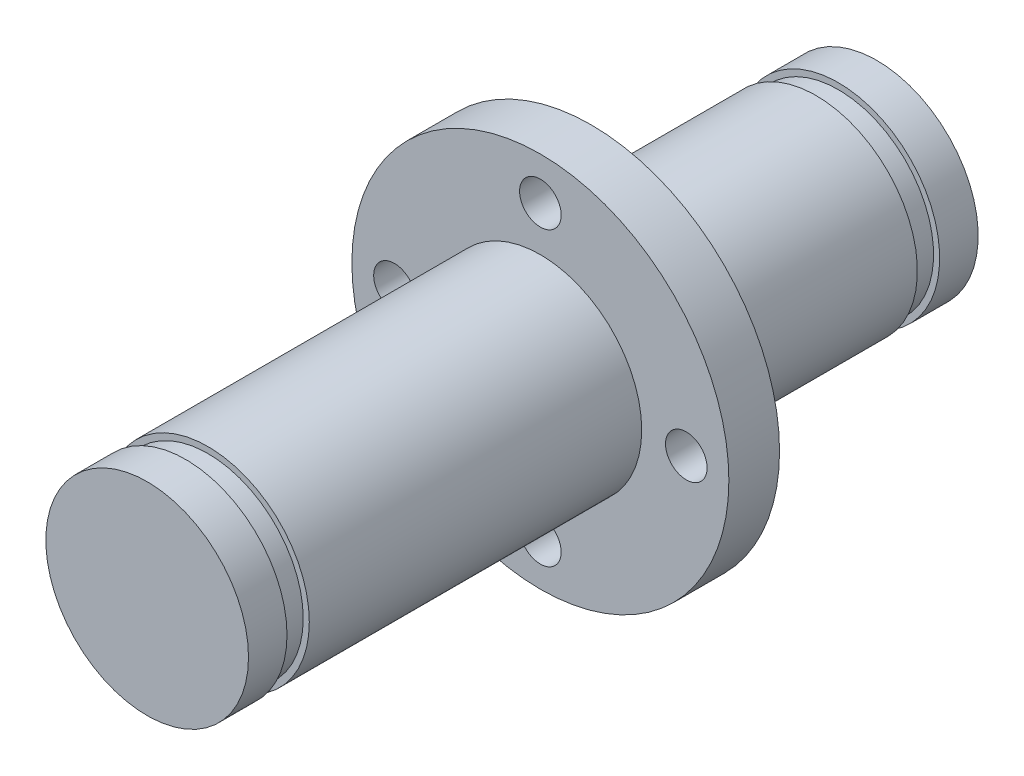
ISO-10303-21;
HEADER;
FILE_DESCRIPTION(('STEP AP214'),'2;1');
FILE_NAME('part.step','',(''),(''),'','','');
FILE_SCHEMA(('AUTOMOTIVE_DESIGN { 1 0 10303 214 1 1 1 1 }'));
ENDSEC;
DATA;
#1=APPLICATION_CONTEXT('core data for automotive mechanical design processes');
#2=APPLICATION_PROTOCOL_DEFINITION('international standard','automotive_design',2000,#1);
#3=PRODUCT_CONTEXT('',#1,'mechanical');
#4=PRODUCT('Part','Part','',(#3));
#5=PRODUCT_RELATED_PRODUCT_CATEGORY('part','',(#4));
#6=PRODUCT_DEFINITION_FORMATION('','',#4);
#7=PRODUCT_DEFINITION_CONTEXT('part definition',#1,'design');
#8=PRODUCT_DEFINITION('design','',#6,#7);
#9=PRODUCT_DEFINITION_SHAPE('','',#8);
#10=(LENGTH_UNIT() NAMED_UNIT(*) SI_UNIT(.MILLI.,.METRE.));
#11=(NAMED_UNIT(*) PLANE_ANGLE_UNIT() SI_UNIT($,.RADIAN.));
#12=(NAMED_UNIT(*) SI_UNIT($,.STERADIAN.) SOLID_ANGLE_UNIT());
#13=UNCERTAINTY_MEASURE_WITH_UNIT(LENGTH_MEASURE(1.E-05),#10,'distance_accuracy_value','');
#14=(GEOMETRIC_REPRESENTATION_CONTEXT(3) GLOBAL_UNCERTAINTY_ASSIGNED_CONTEXT((#13)) GLOBAL_UNIT_ASSIGNED_CONTEXT((#10,
#11,#12)) REPRESENTATION_CONTEXT('',''));
#15=CARTESIAN_POINT('',(0.,0.,0.));
#16=DIRECTION('',(0.,0.,1.));
#17=DIRECTION('',(1.,0.,0.));
#18=AXIS2_PLACEMENT_3D('',#15,#16,#17);
#19=CARTESIAN_POINT('',(0.,0.,-16.6));
#20=DIRECTION('',(0.,0.,1.));
#21=DIRECTION('',(1.,0.,0.));
#22=AXIS2_PLACEMENT_3D('',#19,#20,#21);
#23=CYLINDRICAL_SURFACE('',#22,5.);
#24=CARTESIAN_POINT('',(0.,0.,-2.5));
#25=DIRECTION('',(0.,0.,-1.));
#26=DIRECTION('',(-1.,0.,0.));
#27=AXIS2_PLACEMENT_3D('',#24,#25,#26);
#28=CIRCLE('',#27,5.);
#29=CARTESIAN_POINT('',(-5.,0.,-2.5));
#30=VERTEX_POINT('',#29);
#31=EDGE_CURVE('E10',#30,#30,#28,.T.);
#32=ORIENTED_EDGE('',*,*,#31,.T.);
#33=EDGE_LOOP('',(#32));
#34=FACE_BOUND('',#33,.T.);
#35=CARTESIAN_POINT('',(0.,0.,-13.6));
#36=DIRECTION('',(0.,0.,-1.));
#37=DIRECTION('',(-1.,0.,0.));
#38=AXIS2_PLACEMENT_3D('',#35,#36,#37);
#39=CIRCLE('',#38,5.);
#40=CARTESIAN_POINT('',(-5.,0.,-13.6));
#41=VERTEX_POINT('',#40);
#42=EDGE_CURVE('E98',#41,#41,#39,.T.);
#43=ORIENTED_EDGE('',*,*,#42,.F.);
#44=EDGE_LOOP('',(#43));
#45=FACE_BOUND('',#44,.T.);
#46=ADVANCED_FACE('F34',(#34,#45),#23,.T.);
#47=CARTESIAN_POINT('',(0.,0.,19.4));
#48=DIRECTION('',(0.,0.,-1.));
#49=DIRECTION('',(-1.,0.,0.));
#50=AXIS2_PLACEMENT_3D('',#47,#48,#49);
#51=CYLINDRICAL_SURFACE('',#50,5.);
#52=CARTESIAN_POINT('',(0.,0.,16.4));
#53=DIRECTION('',(0.,0.,1.));
#54=DIRECTION('',(1.,0.,0.));
#55=AXIS2_PLACEMENT_3D('',#52,#53,#54);
#56=CIRCLE('',#55,5.);
#57=CARTESIAN_POINT('',(5.,0.,16.4));
#58=VERTEX_POINT('',#57);
#59=EDGE_CURVE('E86',#58,#58,#56,.T.);
#60=ORIENTED_EDGE('',*,*,#59,.F.);
#61=EDGE_LOOP('',(#60));
#62=FACE_BOUND('',#61,.T.);
#63=CARTESIAN_POINT('',(0.,0.,0.));
#64=DIRECTION('',(0.,0.,1.));
#65=DIRECTION('',(1.,0.,0.));
#66=AXIS2_PLACEMENT_3D('',#63,#64,#65);
#67=CIRCLE('',#66,5.);
#68=CARTESIAN_POINT('',(5.,0.,0.));
#69=VERTEX_POINT('',#68);
#70=EDGE_CURVE('E47',#69,#69,#67,.T.);
#71=ORIENTED_EDGE('',*,*,#70,.T.);
#72=EDGE_LOOP('',(#71));
#73=FACE_BOUND('',#72,.T.);
#74=ADVANCED_FACE('F36',(#62,#73),#51,.T.);
#75=CARTESIAN_POINT('',(0.,0.,-2.5));
#76=DIRECTION('',(0.,0.,1.));
#77=DIRECTION('',(1.,0.,0.));
#78=AXIS2_PLACEMENT_3D('',#75,#76,#77);
#79=CYLINDRICAL_SURFACE('',#78,9.3);
#80=CARTESIAN_POINT('',(0.,0.,-2.5));
#81=DIRECTION('',(0.,0.,-1.));
#82=DIRECTION('',(-1.,0.,0.));
#83=AXIS2_PLACEMENT_3D('',#80,#81,#82);
#84=CIRCLE('',#83,9.3);
#85=CARTESIAN_POINT('',(-9.3,0.,-2.5));
#86=VERTEX_POINT('',#85);
#87=EDGE_CURVE('E53',#86,#86,#84,.T.);
#88=ORIENTED_EDGE('',*,*,#87,.F.);
#89=EDGE_LOOP('',(#88));
#90=FACE_BOUND('',#89,.T.);
#91=CARTESIAN_POINT('',(0.,0.,0.));
#92=DIRECTION('',(0.,0.,-1.));
#93=DIRECTION('',(-1.,0.,0.));
#94=AXIS2_PLACEMENT_3D('',#91,#92,#93);
#95=CIRCLE('',#94,9.3);
#96=CARTESIAN_POINT('',(-9.3,0.,0.));
#97=VERTEX_POINT('',#96);
#98=EDGE_CURVE('E56',#97,#97,#95,.T.);
#99=ORIENTED_EDGE('',*,*,#98,.T.);
#100=EDGE_LOOP('',(#99));
#101=FACE_BOUND('',#100,.T.);
#102=ADVANCED_FACE('F134',(#90,#101),#79,.T.);
#103=CARTESIAN_POINT('',(0.,0.,-2.5));
#104=DIRECTION('',(0.,0.,-1.));
#105=DIRECTION('',(-1.,0.,0.));
#106=AXIS2_PLACEMENT_3D('',#103,#104,#105);
#107=PLANE('',#106);
#108=CARTESIAN_POINT('',(0.,7.2,-2.5));
#109=DIRECTION('',(0.,0.,-1.));
#110=DIRECTION('',(-1.,0.,0.));
#111=AXIS2_PLACEMENT_3D('',#108,#109,#110);
#112=CIRCLE('',#111,1.02499999999999);
#113=CARTESIAN_POINT('',(-1.02499999999999,7.2,-2.5));
#114=VERTEX_POINT('',#113);
#115=EDGE_CURVE('E74',#114,#114,#112,.T.);
#116=ORIENTED_EDGE('',*,*,#115,.F.);
#117=EDGE_LOOP('',(#116));
#118=FACE_BOUND('',#117,.T.);
#119=CARTESIAN_POINT('',(-7.2,0.,-2.5));
#120=DIRECTION('',(0.,0.,-1.));
#121=DIRECTION('',(-1.,0.,0.));
#122=AXIS2_PLACEMENT_3D('',#119,#120,#121);
#123=CIRCLE('',#122,1.02499999999999);
#124=CARTESIAN_POINT('',(-8.22499999999999,0.,-2.5));
#125=VERTEX_POINT('',#124);
#126=EDGE_CURVE('E63',#125,#125,#123,.T.);
#127=ORIENTED_EDGE('',*,*,#126,.F.);
#128=EDGE_LOOP('',(#127));
#129=FACE_BOUND('',#128,.T.);
#130=CARTESIAN_POINT('',(7.2,0.,-2.5));
#131=DIRECTION('',(0.,0.,-1.));
#132=DIRECTION('',(-1.,0.,0.));
#133=AXIS2_PLACEMENT_3D('',#130,#131,#132);
#134=CIRCLE('',#133,1.02499999999999);
#135=CARTESIAN_POINT('',(6.17500000000001,0.,-2.5));
#136=VERTEX_POINT('',#135);
#137=EDGE_CURVE('E62',#136,#136,#134,.T.);
#138=ORIENTED_EDGE('',*,*,#137,.F.);
#139=EDGE_LOOP('',(#138));
#140=FACE_BOUND('',#139,.T.);
#141=CARTESIAN_POINT('',(0.,-7.2,-2.5));
#142=DIRECTION('',(0.,0.,-1.));
#143=DIRECTION('',(-1.,0.,0.));
#144=AXIS2_PLACEMENT_3D('',#141,#142,#143);
#145=CIRCLE('',#144,1.02499999999999);
#146=CARTESIAN_POINT('',(-1.02499999999999,-7.2,-2.5));
#147=VERTEX_POINT('',#146);
#148=EDGE_CURVE('E80',#147,#147,#145,.T.);
#149=ORIENTED_EDGE('',*,*,#148,.F.);
#150=EDGE_LOOP('',(#149));
#151=FACE_BOUND('',#150,.T.);
#152=ORIENTED_EDGE('',*,*,#31,.F.);
#153=EDGE_LOOP('',(#152));
#154=FACE_BOUND('',#153,.T.);
#155=ORIENTED_EDGE('',*,*,#87,.T.);
#156=EDGE_LOOP('',(#155));
#157=FACE_BOUND('',#156,.T.);
#158=ADVANCED_FACE('F159',(#118,#129,#140,#151,#154,#157),#107,.T.);
#159=CARTESIAN_POINT('',(0.,0.,0.));
#160=DIRECTION('',(0.,0.,-1.));
#161=DIRECTION('',(-1.,0.,0.));
#162=AXIS2_PLACEMENT_3D('',#159,#160,#161);
#163=PLANE('',#162);
#164=CARTESIAN_POINT('',(0.,7.2,0.));
#165=DIRECTION('',(0.,0.,-1.));
#166=DIRECTION('',(-1.,0.,0.));
#167=AXIS2_PLACEMENT_3D('',#164,#165,#166);
#168=CIRCLE('',#167,1.02499999999999);
#169=CARTESIAN_POINT('',(-1.02499999999999,7.2,0.));
#170=VERTEX_POINT('',#169);
#171=EDGE_CURVE('E38',#170,#170,#168,.T.);
#172=ORIENTED_EDGE('',*,*,#171,.T.);
#173=EDGE_LOOP('',(#172));
#174=FACE_BOUND('',#173,.T.);
#175=CARTESIAN_POINT('',(-7.2,0.,0.));
#176=DIRECTION('',(0.,0.,-1.));
#177=DIRECTION('',(-1.,0.,0.));
#178=AXIS2_PLACEMENT_3D('',#175,#176,#177);
#179=CIRCLE('',#178,1.02499999999999);
#180=CARTESIAN_POINT('',(-8.22499999999999,0.,0.));
#181=VERTEX_POINT('',#180);
#182=EDGE_CURVE('E60',#181,#181,#179,.T.);
#183=ORIENTED_EDGE('',*,*,#182,.T.);
#184=EDGE_LOOP('',(#183));
#185=FACE_BOUND('',#184,.T.);
#186=CARTESIAN_POINT('',(7.2,0.,0.));
#187=DIRECTION('',(0.,0.,-1.));
#188=DIRECTION('',(-1.,0.,0.));
#189=AXIS2_PLACEMENT_3D('',#186,#187,#188);
#190=CIRCLE('',#189,1.02499999999999);
#191=CARTESIAN_POINT('',(6.17500000000001,0.,0.));
#192=VERTEX_POINT('',#191);
#193=EDGE_CURVE('E67',#192,#192,#190,.T.);
#194=ORIENTED_EDGE('',*,*,#193,.T.);
#195=EDGE_LOOP('',(#194));
#196=FACE_BOUND('',#195,.T.);
#197=CARTESIAN_POINT('',(0.,-7.2,0.));
#198=DIRECTION('',(0.,0.,-1.));
#199=DIRECTION('',(-1.,0.,0.));
#200=AXIS2_PLACEMENT_3D('',#197,#198,#199);
#201=CIRCLE('',#200,1.02499999999999);
#202=CARTESIAN_POINT('',(-1.02499999999999,-7.2,0.));
#203=VERTEX_POINT('',#202);
#204=EDGE_CURVE('E83',#203,#203,#201,.T.);
#205=ORIENTED_EDGE('',*,*,#204,.T.);
#206=EDGE_LOOP('',(#205));
#207=FACE_BOUND('',#206,.T.);
#208=ORIENTED_EDGE('',*,*,#70,.F.);
#209=EDGE_LOOP('',(#208));
#210=FACE_BOUND('',#209,.T.);
#211=ORIENTED_EDGE('',*,*,#98,.F.);
#212=EDGE_LOOP('',(#211));
#213=FACE_BOUND('',#212,.T.);
#214=ADVANCED_FACE('F154',(#174,#185,#196,#207,#210,#213),#163,.F.);
#215=CARTESIAN_POINT('',(5.,0.,-14.7));
#216=DIRECTION('',(0.,0.,1.));
#217=DIRECTION('',(1.,0.,0.));
#218=AXIS2_PLACEMENT_3D('',#215,#216,#217);
#219=PLANE('',#218);
#220=CARTESIAN_POINT('',(0.,0.,-14.7));
#221=DIRECTION('',(0.,0.,-1.));
#222=DIRECTION('',(-1.,0.,0.));
#223=AXIS2_PLACEMENT_3D('',#220,#221,#222);
#224=CIRCLE('',#223,4.7);
#225=CARTESIAN_POINT('',(-4.7,0.,-14.7));
#226=VERTEX_POINT('',#225);
#227=EDGE_CURVE('E104',#226,#226,#224,.T.);
#228=ORIENTED_EDGE('',*,*,#227,.T.);
#229=EDGE_LOOP('',(#228));
#230=FACE_BOUND('',#229,.T.);
#231=CARTESIAN_POINT('',(0.,0.,-14.7));
#232=DIRECTION('',(0.,0.,-1.));
#233=DIRECTION('',(-1.,0.,0.));
#234=AXIS2_PLACEMENT_3D('',#231,#232,#233);
#235=CIRCLE('',#234,5.);
#236=CARTESIAN_POINT('',(-5.,0.,-14.7));
#237=VERTEX_POINT('',#236);
#238=EDGE_CURVE('E106',#237,#237,#235,.T.);
#239=ORIENTED_EDGE('',*,*,#238,.F.);
#240=EDGE_LOOP('',(#239));
#241=FACE_BOUND('',#240,.T.);
#242=ADVANCED_FACE('F148',(#230,#241),#219,.T.);
#243=CARTESIAN_POINT('',(0.,0.,-16.6));
#244=DIRECTION('',(0.,0.,-1.));
#245=DIRECTION('',(-1.,0.,0.));
#246=AXIS2_PLACEMENT_3D('',#243,#244,#245);
#247=CYLINDRICAL_SURFACE('',#246,4.7);
#248=CARTESIAN_POINT('',(0.,0.,-13.6));
#249=DIRECTION('',(0.,0.,-1.));
#250=DIRECTION('',(-1.,0.,0.));
#251=AXIS2_PLACEMENT_3D('',#248,#249,#250);
#252=CIRCLE('',#251,4.7);
#253=CARTESIAN_POINT('',(-4.7,0.,-13.6));
#254=VERTEX_POINT('',#253);
#255=EDGE_CURVE('E101',#254,#254,#252,.T.);
#256=ORIENTED_EDGE('',*,*,#255,.T.);
#257=EDGE_LOOP('',(#256));
#258=FACE_BOUND('',#257,.T.);
#259=ORIENTED_EDGE('',*,*,#227,.F.);
#260=EDGE_LOOP('',(#259));
#261=FACE_BOUND('',#260,.T.);
#262=ADVANCED_FACE('F142',(#258,#261),#247,.T.);
#263=CARTESIAN_POINT('',(5.,0.,-13.6));
#264=DIRECTION('',(0.,0.,-1.));
#265=DIRECTION('',(-1.,0.,0.));
#266=AXIS2_PLACEMENT_3D('',#263,#264,#265);
#267=PLANE('',#266);
#268=ORIENTED_EDGE('',*,*,#42,.T.);
#269=EDGE_LOOP('',(#268));
#270=FACE_BOUND('',#269,.T.);
#271=ORIENTED_EDGE('',*,*,#255,.F.);
#272=EDGE_LOOP('',(#271));
#273=FACE_BOUND('',#272,.T.);
#274=ADVANCED_FACE('F126',(#270,#273),#267,.T.);
#275=CARTESIAN_POINT('',(0.,0.,-16.6));
#276=DIRECTION('',(0.,0.,-1.));
#277=DIRECTION('',(-1.,0.,0.));
#278=AXIS2_PLACEMENT_3D('',#275,#276,#277);
#279=PLANE('',#278);
#280=CARTESIAN_POINT('',(0.,0.,-16.6));
#281=DIRECTION('',(0.,0.,-1.));
#282=DIRECTION('',(-1.,0.,0.));
#283=AXIS2_PLACEMENT_3D('',#280,#281,#282);
#284=CIRCLE('',#283,2.);
#285=CARTESIAN_POINT('',(-2.,0.,-16.6));
#286=VERTEX_POINT('',#285);
#287=EDGE_CURVE('E198',#286,#286,#284,.T.);
#288=ORIENTED_EDGE('',*,*,#287,.F.);
#289=EDGE_LOOP('',(#288));
#290=FACE_BOUND('',#289,.T.);
#291=CARTESIAN_POINT('',(0.,0.,-16.6));
#292=DIRECTION('',(0.,0.,-1.));
#293=DIRECTION('',(-1.,0.,0.));
#294=AXIS2_PLACEMENT_3D('',#291,#292,#293);
#295=CIRCLE('',#294,5.);
#296=CARTESIAN_POINT('',(-5.,0.,-16.6));
#297=VERTEX_POINT('',#296);
#298=EDGE_CURVE('E51',#297,#297,#295,.T.);
#299=ORIENTED_EDGE('',*,*,#298,.T.);
#300=EDGE_LOOP('',(#299));
#301=FACE_BOUND('',#300,.T.);
#302=ADVANCED_FACE('F113',(#290,#301),#279,.T.);
#303=ORIENTED_EDGE('',*,*,#298,.F.);
#304=EDGE_LOOP('',(#303));
#305=FACE_BOUND('',#304,.T.);
#306=ORIENTED_EDGE('',*,*,#238,.T.);
#307=EDGE_LOOP('',(#306));
#308=FACE_BOUND('',#307,.T.);
#309=ADVANCED_FACE('F115',(#305,#308),#23,.T.);
#310=CARTESIAN_POINT('',(5.,0.,17.5));
#311=DIRECTION('',(0.,0.,1.));
#312=DIRECTION('',(1.,0.,0.));
#313=AXIS2_PLACEMENT_3D('',#310,#311,#312);
#314=PLANE('',#313);
#315=CARTESIAN_POINT('',(0.,0.,17.5));
#316=DIRECTION('',(0.,0.,1.));
#317=DIRECTION('',(1.,0.,0.));
#318=AXIS2_PLACEMENT_3D('',#315,#316,#317);
#319=CIRCLE('',#318,5.);
#320=CARTESIAN_POINT('',(5.,0.,17.5));
#321=VERTEX_POINT('',#320);
#322=EDGE_CURVE('E95',#321,#321,#319,.T.);
#323=ORIENTED_EDGE('',*,*,#322,.F.);
#324=EDGE_LOOP('',(#323));
#325=FACE_BOUND('',#324,.T.);
#326=CARTESIAN_POINT('',(0.,0.,17.5));
#327=DIRECTION('',(0.,0.,1.));
#328=DIRECTION('',(1.,0.,0.));
#329=AXIS2_PLACEMENT_3D('',#326,#327,#328);
#330=CIRCLE('',#329,4.7);
#331=CARTESIAN_POINT('',(4.7,0.,17.5));
#332=VERTEX_POINT('',#331);
#333=EDGE_CURVE('E92',#332,#332,#330,.T.);
#334=ORIENTED_EDGE('',*,*,#333,.T.);
#335=EDGE_LOOP('',(#334));
#336=FACE_BOUND('',#335,.T.);
#337=ADVANCED_FACE('F117',(#325,#336),#314,.F.);
#338=CARTESIAN_POINT('',(0.,0.,19.4));
#339=DIRECTION('',(0.,0.,1.));
#340=DIRECTION('',(1.,0.,0.));
#341=AXIS2_PLACEMENT_3D('',#338,#339,#340);
#342=CYLINDRICAL_SURFACE('',#341,4.7);
#343=ORIENTED_EDGE('',*,*,#333,.F.);
#344=EDGE_LOOP('',(#343));
#345=FACE_BOUND('',#344,.T.);
#346=CARTESIAN_POINT('',(0.,0.,16.4));
#347=DIRECTION('',(0.,0.,1.));
#348=DIRECTION('',(1.,0.,0.));
#349=AXIS2_PLACEMENT_3D('',#346,#347,#348);
#350=CIRCLE('',#349,4.7);
#351=CARTESIAN_POINT('',(4.7,0.,16.4));
#352=VERTEX_POINT('',#351);
#353=EDGE_CURVE('E89',#352,#352,#350,.T.);
#354=ORIENTED_EDGE('',*,*,#353,.T.);
#355=EDGE_LOOP('',(#354));
#356=FACE_BOUND('',#355,.T.);
#357=ADVANCED_FACE('F123',(#345,#356),#342,.T.);
#358=CARTESIAN_POINT('',(5.,0.,16.4));
#359=DIRECTION('',(0.,0.,-1.));
#360=DIRECTION('',(-1.,0.,0.));
#361=AXIS2_PLACEMENT_3D('',#358,#359,#360);
#362=PLANE('',#361);
#363=ORIENTED_EDGE('',*,*,#353,.F.);
#364=EDGE_LOOP('',(#363));
#365=FACE_BOUND('',#364,.T.);
#366=ORIENTED_EDGE('',*,*,#59,.T.);
#367=EDGE_LOOP('',(#366));
#368=FACE_BOUND('',#367,.T.);
#369=ADVANCED_FACE('F165',(#365,#368),#362,.F.);
#370=CARTESIAN_POINT('',(0.,0.,19.4));
#371=DIRECTION('',(0.,0.,1.));
#372=DIRECTION('',(1.,0.,0.));
#373=AXIS2_PLACEMENT_3D('',#370,#371,#372);
#374=PLANE('',#373);
#375=CARTESIAN_POINT('',(0.,0.,19.4));
#376=DIRECTION('',(0.,0.,1.));
#377=DIRECTION('',(1.,0.,0.));
#378=AXIS2_PLACEMENT_3D('',#375,#376,#377);
#379=CIRCLE('',#378,5.);
#380=CARTESIAN_POINT('',(5.,0.,19.4));
#381=VERTEX_POINT('',#380);
#382=EDGE_CURVE('E42',#381,#381,#379,.T.);
#383=ORIENTED_EDGE('',*,*,#382,.T.);
#384=EDGE_LOOP('',(#383));
#385=FACE_BOUND('',#384,.T.);
#386=ADVANCED_FACE('F169',(#385),#374,.T.);
#387=ORIENTED_EDGE('',*,*,#322,.T.);
#388=EDGE_LOOP('',(#387));
#389=FACE_BOUND('',#388,.T.);
#390=ORIENTED_EDGE('',*,*,#382,.F.);
#391=EDGE_LOOP('',(#390));
#392=FACE_BOUND('',#391,.T.);
#393=ADVANCED_FACE('F136',(#389,#392),#51,.T.);
#394=CARTESIAN_POINT('',(0.,-7.2,-2.5));
#395=DIRECTION('',(0.,0.,-1.));
#396=DIRECTION('',(-1.,0.,0.));
#397=AXIS2_PLACEMENT_3D('',#394,#395,#396);
#398=CYLINDRICAL_SURFACE('',#397,1.02499999999999);
#399=ORIENTED_EDGE('',*,*,#148,.T.);
#400=EDGE_LOOP('',(#399));
#401=FACE_BOUND('',#400,.T.);
#402=ORIENTED_EDGE('',*,*,#204,.F.);
#403=EDGE_LOOP('',(#402));
#404=FACE_BOUND('',#403,.T.);
#405=ADVANCED_FACE('F171',(#401,#404),#398,.F.);
#406=CARTESIAN_POINT('',(7.2,0.,-2.5));
#407=DIRECTION('',(0.,0.,-1.));
#408=DIRECTION('',(-1.,0.,0.));
#409=AXIS2_PLACEMENT_3D('',#406,#407,#408);
#410=CYLINDRICAL_SURFACE('',#409,1.02499999999999);
#411=ORIENTED_EDGE('',*,*,#137,.T.);
#412=EDGE_LOOP('',(#411));
#413=FACE_BOUND('',#412,.T.);
#414=ORIENTED_EDGE('',*,*,#193,.F.);
#415=EDGE_LOOP('',(#414));
#416=FACE_BOUND('',#415,.T.);
#417=ADVANCED_FACE('F174',(#413,#416),#410,.F.);
#418=CARTESIAN_POINT('',(-7.2,0.,-2.5));
#419=DIRECTION('',(0.,0.,-1.));
#420=DIRECTION('',(-1.,0.,0.));
#421=AXIS2_PLACEMENT_3D('',#418,#419,#420);
#422=CYLINDRICAL_SURFACE('',#421,1.02499999999999);
#423=ORIENTED_EDGE('',*,*,#126,.T.);
#424=EDGE_LOOP('',(#423));
#425=FACE_BOUND('',#424,.T.);
#426=ORIENTED_EDGE('',*,*,#182,.F.);
#427=EDGE_LOOP('',(#426));
#428=FACE_BOUND('',#427,.T.);
#429=ADVANCED_FACE('F178',(#425,#428),#422,.F.);
#430=CARTESIAN_POINT('',(0.,7.2,-2.5));
#431=DIRECTION('',(0.,0.,-1.));
#432=DIRECTION('',(-1.,0.,0.));
#433=AXIS2_PLACEMENT_3D('',#430,#431,#432);
#434=CYLINDRICAL_SURFACE('',#433,1.02499999999999);
#435=ORIENTED_EDGE('',*,*,#115,.T.);
#436=EDGE_LOOP('',(#435));
#437=FACE_BOUND('',#436,.T.);
#438=ORIENTED_EDGE('',*,*,#171,.F.);
#439=EDGE_LOOP('',(#438));
#440=FACE_BOUND('',#439,.T.);
#441=ADVANCED_FACE('F182',(#437,#440),#434,.F.);
#442=CARTESIAN_POINT('',(0.,0.,11.4));
#443=DIRECTION('',(0.,0.,-1.));
#444=DIRECTION('',(-1.,0.,0.));
#445=AXIS2_PLACEMENT_3D('',#442,#443,#444);
#446=CYLINDRICAL_SURFACE('',#445,2.);
#447=CARTESIAN_POINT('',(0.,0.,11.4));
#448=DIRECTION('',(0.,0.,-1.));
#449=DIRECTION('',(-1.,0.,0.));
#450=AXIS2_PLACEMENT_3D('',#447,#448,#449);
#451=CIRCLE('',#450,2.);
#452=CARTESIAN_POINT('',(-2.,0.,11.4));
#453=VERTEX_POINT('',#452);
#454=EDGE_CURVE('E197',#453,#453,#451,.T.);
#455=ORIENTED_EDGE('',*,*,#454,.F.);
#456=EDGE_LOOP('',(#455));
#457=FACE_BOUND('',#456,.T.);
#458=ORIENTED_EDGE('',*,*,#287,.T.);
#459=EDGE_LOOP('',(#458));
#460=FACE_BOUND('',#459,.T.);
#461=ADVANCED_FACE('F185',(#457,#460),#446,.F.);
#462=CARTESIAN_POINT('',(0.,0.,11.4));
#463=DIRECTION('',(0.,0.,-1.));
#464=DIRECTION('',(-1.,0.,0.));
#465=AXIS2_PLACEMENT_3D('',#462,#463,#464);
#466=PLANE('',#465);
#467=ORIENTED_EDGE('',*,*,#454,.T.);
#468=EDGE_LOOP('',(#467));
#469=FACE_BOUND('',#468,.T.);
#470=ADVANCED_FACE('F189',(#469),#466,.T.);
#471=CLOSED_SHELL('',(#46,#74,#102,#158,#214,#242,#262,#274,#302,#309,#337,#357,#369,#386,#393,
#405,#417,#429,#441,#461,#470));
#472=MANIFOLD_SOLID_BREP('B2',#471);
#473=ADVANCED_BREP_SHAPE_REPRESENTATION('',(#18,#472),#14);
#474=SHAPE_DEFINITION_REPRESENTATION(#9,#473);
ENDSEC;
END-ISO-10303-21;
